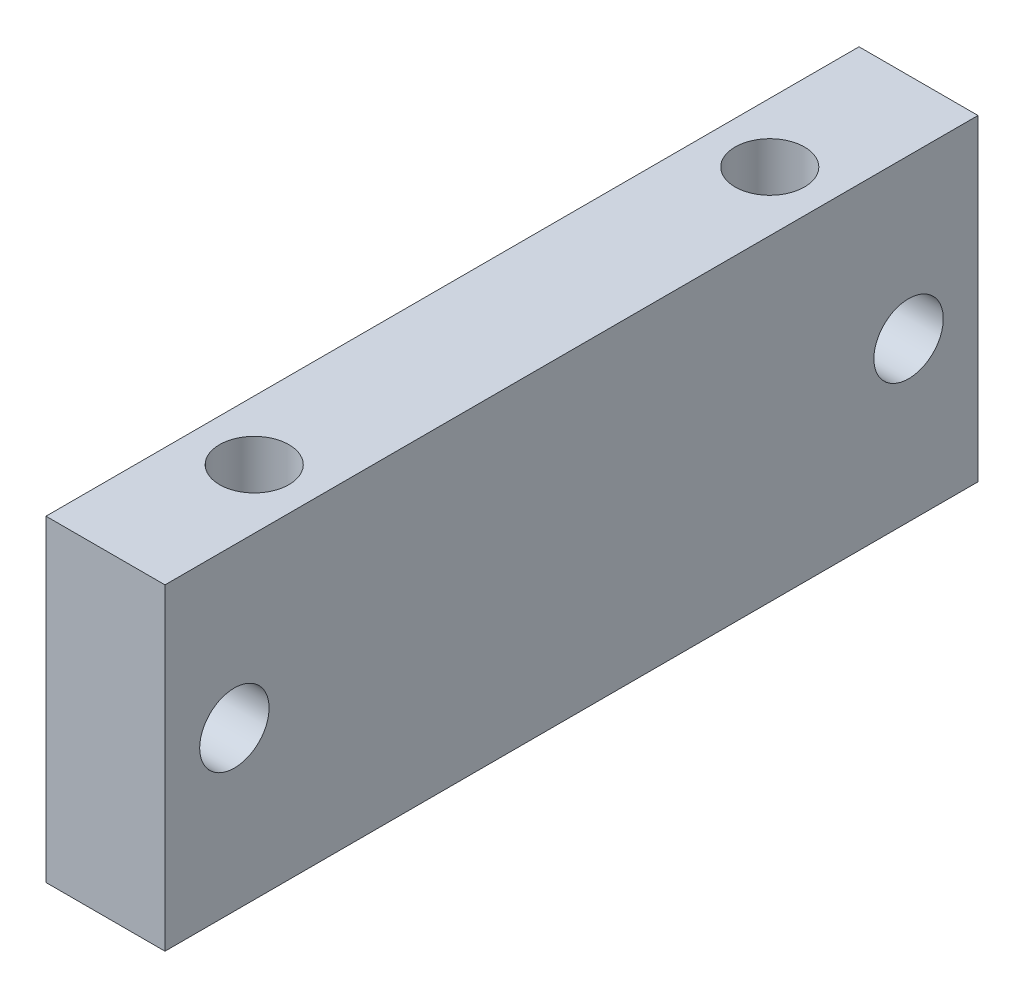
ISO-10303-21;
HEADER;
FILE_DESCRIPTION(('STEP AP214'),'2;1');
FILE_NAME('part.step','',(''),(''),'','','');
FILE_SCHEMA(('AUTOMOTIVE_DESIGN { 1 0 10303 214 1 1 1 1 }'));
ENDSEC;
DATA;
#1=APPLICATION_CONTEXT('core data for automotive mechanical design processes');
#2=APPLICATION_PROTOCOL_DEFINITION('international standard','automotive_design',2000,#1);
#3=PRODUCT_CONTEXT('',#1,'mechanical');
#4=PRODUCT('Part','Part','',(#3));
#5=PRODUCT_RELATED_PRODUCT_CATEGORY('part','',(#4));
#6=PRODUCT_DEFINITION_FORMATION('','',#4);
#7=PRODUCT_DEFINITION_CONTEXT('part definition',#1,'design');
#8=PRODUCT_DEFINITION('design','',#6,#7);
#9=PRODUCT_DEFINITION_SHAPE('','',#8);
#10=(LENGTH_UNIT() NAMED_UNIT(*) SI_UNIT(.MILLI.,.METRE.));
#11=(NAMED_UNIT(*) PLANE_ANGLE_UNIT() SI_UNIT($,.RADIAN.));
#12=(NAMED_UNIT(*) SI_UNIT($,.STERADIAN.) SOLID_ANGLE_UNIT());
#13=UNCERTAINTY_MEASURE_WITH_UNIT(LENGTH_MEASURE(1.E-05),#10,'distance_accuracy_value','');
#14=(GEOMETRIC_REPRESENTATION_CONTEXT(3) GLOBAL_UNCERTAINTY_ASSIGNED_CONTEXT((#13)) GLOBAL_UNIT_ASSIGNED_CONTEXT((#10,
#11,#12)) REPRESENTATION_CONTEXT('',''));
#15=CARTESIAN_POINT('',(0.,0.,0.));
#16=DIRECTION('',(0.,0.,1.));
#17=DIRECTION('',(1.,0.,0.));
#18=AXIS2_PLACEMENT_3D('',#15,#16,#17);
#19=CARTESIAN_POINT('',(3.,16.,20.5));
#20=DIRECTION('',(-1.,0.,0.));
#21=DIRECTION('',(0.,0.,1.));
#22=AXIS2_PLACEMENT_3D('',#19,#20,#21);
#23=PLANE('',#22);
#24=CARTESIAN_POINT('',(3.,8.,-17.));
#25=DIRECTION('',(-1.,0.,0.));
#26=DIRECTION('',(0.,0.,1.));
#27=AXIS2_PLACEMENT_3D('',#24,#25,#26);
#28=CIRCLE('',#27,1.75);
#29=CARTESIAN_POINT('',(3.,8.,-15.25));
#30=VERTEX_POINT('',#29);
#31=EDGE_CURVE('E122',#30,#30,#28,.T.);
#32=ORIENTED_EDGE('',*,*,#31,.T.);
#33=EDGE_LOOP('',(#32));
#34=FACE_BOUND('',#33,.T.);
#35=CARTESIAN_POINT('',(3.,8.,17.));
#36=DIRECTION('',(-1.,0.,0.));
#37=DIRECTION('',(0.,0.,1.));
#38=AXIS2_PLACEMENT_3D('',#35,#36,#37);
#39=CIRCLE('',#38,1.75);
#40=CARTESIAN_POINT('',(3.,8.,18.75));
#41=VERTEX_POINT('',#40);
#42=EDGE_CURVE('E130',#41,#41,#39,.T.);
#43=ORIENTED_EDGE('',*,*,#42,.T.);
#44=EDGE_LOOP('',(#43));
#45=FACE_BOUND('',#44,.T.);
#46=DIRECTION('',(0.,0.,-1.));
#47=VECTOR('',#46,1.);
#48=CARTESIAN_POINT('',(3.,0.,20.5));
#49=LINE('',#48,#47);
#50=CARTESIAN_POINT('',(3.,0.,20.5));
#51=VERTEX_POINT('',#50);
#52=CARTESIAN_POINT('',(3.,0.,-20.5));
#53=VERTEX_POINT('',#52);
#54=EDGE_CURVE('E104',#51,#53,#49,.T.);
#55=ORIENTED_EDGE('',*,*,#54,.T.);
#56=DIRECTION('',(0.,-1.,0.));
#57=VECTOR('',#56,1.);
#58=CARTESIAN_POINT('',(3.,16.,-20.5));
#59=LINE('',#58,#57);
#60=CARTESIAN_POINT('',(3.,16.,-20.5));
#61=VERTEX_POINT('',#60);
#62=EDGE_CURVE('E11',#61,#53,#59,.T.);
#63=ORIENTED_EDGE('',*,*,#62,.F.);
#64=DIRECTION('',(0.,0.,-1.));
#65=VECTOR('',#64,1.);
#66=CARTESIAN_POINT('',(3.,16.,20.5));
#67=LINE('',#66,#65);
#68=CARTESIAN_POINT('',(3.,16.,20.5));
#69=VERTEX_POINT('',#68);
#70=EDGE_CURVE('E92',#69,#61,#67,.T.);
#71=ORIENTED_EDGE('',*,*,#70,.F.);
#72=DIRECTION('',(0.,-1.,0.));
#73=VECTOR('',#72,1.);
#74=CARTESIAN_POINT('',(3.,16.,20.5));
#75=LINE('',#74,#73);
#76=EDGE_CURVE('E100',#69,#51,#75,.T.);
#77=ORIENTED_EDGE('',*,*,#76,.T.);
#78=EDGE_LOOP('',(#55,#63,#71,#77));
#79=FACE_BOUND('',#78,.T.);
#80=ADVANCED_FACE('F41',(#34,#45,#79),#23,.F.);
#81=CARTESIAN_POINT('',(-3.,16.,-20.5));
#82=DIRECTION('',(0.,0.,1.));
#83=DIRECTION('',(1.,0.,0.));
#84=AXIS2_PLACEMENT_3D('',#81,#82,#83);
#85=PLANE('',#84);
#86=DIRECTION('',(-1.,0.,0.));
#87=VECTOR('',#86,1.);
#88=CARTESIAN_POINT('',(-3.,0.,-20.5));
#89=LINE('',#88,#87);
#90=CARTESIAN_POINT('',(-3.,0.,-20.5));
#91=VERTEX_POINT('',#90);
#92=EDGE_CURVE('E96',#53,#91,#89,.T.);
#93=ORIENTED_EDGE('',*,*,#92,.T.);
#94=DIRECTION('',(0.,-1.,0.));
#95=VECTOR('',#94,1.);
#96=CARTESIAN_POINT('',(-3.,16.,-20.5));
#97=LINE('',#96,#95);
#98=CARTESIAN_POINT('',(-3.,16.,-20.5));
#99=VERTEX_POINT('',#98);
#100=EDGE_CURVE('E49',#99,#91,#97,.T.);
#101=ORIENTED_EDGE('',*,*,#100,.F.);
#102=DIRECTION('',(-1.,0.,0.));
#103=VECTOR('',#102,1.);
#104=CARTESIAN_POINT('',(-3.,16.,-20.5));
#105=LINE('',#104,#103);
#106=EDGE_CURVE('E87',#61,#99,#105,.T.);
#107=ORIENTED_EDGE('',*,*,#106,.F.);
#108=ORIENTED_EDGE('',*,*,#62,.T.);
#109=EDGE_LOOP('',(#93,#101,#107,#108));
#110=FACE_BOUND('',#109,.T.);
#111=ADVANCED_FACE('F95',(#110),#85,.F.);
#112=CARTESIAN_POINT('',(-3.,16.,20.5));
#113=DIRECTION('',(1.,0.,0.));
#114=DIRECTION('',(0.,0.,-1.));
#115=AXIS2_PLACEMENT_3D('',#112,#113,#114);
#116=PLANE('',#115);
#117=CARTESIAN_POINT('',(-3.,8.,-17.));
#118=DIRECTION('',(-1.,0.,0.));
#119=DIRECTION('',(0.,0.,1.));
#120=AXIS2_PLACEMENT_3D('',#117,#118,#119);
#121=CIRCLE('',#120,1.75);
#122=CARTESIAN_POINT('',(-3.,8.,-15.25));
#123=VERTEX_POINT('',#122);
#124=EDGE_CURVE('E136',#123,#123,#121,.T.);
#125=ORIENTED_EDGE('',*,*,#124,.F.);
#126=EDGE_LOOP('',(#125));
#127=FACE_BOUND('',#126,.T.);
#128=CARTESIAN_POINT('',(-3.,8.,17.));
#129=DIRECTION('',(-1.,0.,0.));
#130=DIRECTION('',(0.,0.,1.));
#131=AXIS2_PLACEMENT_3D('',#128,#129,#130);
#132=CIRCLE('',#131,1.75);
#133=CARTESIAN_POINT('',(-3.,8.,18.75));
#134=VERTEX_POINT('',#133);
#135=EDGE_CURVE('E133',#134,#134,#132,.T.);
#136=ORIENTED_EDGE('',*,*,#135,.F.);
#137=EDGE_LOOP('',(#136));
#138=FACE_BOUND('',#137,.T.);
#139=DIRECTION('',(0.,0.,1.));
#140=VECTOR('',#139,1.);
#141=CARTESIAN_POINT('',(-3.,0.,20.5));
#142=LINE('',#141,#140);
#143=CARTESIAN_POINT('',(-3.,0.,20.5));
#144=VERTEX_POINT('',#143);
#145=EDGE_CURVE('E74',#91,#144,#142,.T.);
#146=ORIENTED_EDGE('',*,*,#145,.T.);
#147=DIRECTION('',(0.,-1.,0.));
#148=VECTOR('',#147,1.);
#149=CARTESIAN_POINT('',(-3.,16.,20.5));
#150=LINE('',#149,#148);
#151=CARTESIAN_POINT('',(-3.,16.,20.5));
#152=VERTEX_POINT('',#151);
#153=EDGE_CURVE('E97',#152,#144,#150,.T.);
#154=ORIENTED_EDGE('',*,*,#153,.F.);
#155=DIRECTION('',(0.,0.,1.));
#156=VECTOR('',#155,1.);
#157=CARTESIAN_POINT('',(-3.,16.,20.5));
#158=LINE('',#157,#156);
#159=EDGE_CURVE('E90',#99,#152,#158,.T.);
#160=ORIENTED_EDGE('',*,*,#159,.F.);
#161=ORIENTED_EDGE('',*,*,#100,.T.);
#162=EDGE_LOOP('',(#146,#154,#160,#161));
#163=FACE_BOUND('',#162,.T.);
#164=ADVANCED_FACE('F98',(#127,#138,#163),#116,.F.);
#165=CARTESIAN_POINT('',(-3.,16.,20.5));
#166=DIRECTION('',(0.,0.,-1.));
#167=DIRECTION('',(-1.,0.,0.));
#168=AXIS2_PLACEMENT_3D('',#165,#166,#167);
#169=PLANE('',#168);
#170=DIRECTION('',(1.,0.,0.));
#171=VECTOR('',#170,1.);
#172=CARTESIAN_POINT('',(-3.,0.,20.5));
#173=LINE('',#172,#171);
#174=EDGE_CURVE('E80',#144,#51,#173,.T.);
#175=ORIENTED_EDGE('',*,*,#174,.T.);
#176=ORIENTED_EDGE('',*,*,#76,.F.);
#177=DIRECTION('',(1.,0.,0.));
#178=VECTOR('',#177,1.);
#179=CARTESIAN_POINT('',(-3.,16.,20.5));
#180=LINE('',#179,#178);
#181=EDGE_CURVE('E57',#152,#69,#180,.T.);
#182=ORIENTED_EDGE('',*,*,#181,.F.);
#183=ORIENTED_EDGE('',*,*,#153,.T.);
#184=EDGE_LOOP('',(#175,#176,#182,#183));
#185=FACE_BOUND('',#184,.T.);
#186=ADVANCED_FACE('F112',(#185),#169,.F.);
#187=CARTESIAN_POINT('',(0.,16.,0.));
#188=DIRECTION('',(0.,-1.,0.));
#189=DIRECTION('',(0.,0.,-1.));
#190=AXIS2_PLACEMENT_3D('',#187,#188,#189);
#191=PLANE('',#190);
#192=CARTESIAN_POINT('',(0.,16.,-13.));
#193=DIRECTION('',(0.,1.,0.));
#194=DIRECTION('',(0.,0.,1.));
#195=AXIS2_PLACEMENT_3D('',#192,#193,#194);
#196=CIRCLE('',#195,1.75);
#197=CARTESIAN_POINT('',(0.,16.,-11.25));
#198=VERTEX_POINT('',#197);
#199=EDGE_CURVE('E125',#198,#198,#196,.T.);
#200=ORIENTED_EDGE('',*,*,#199,.F.);
#201=EDGE_LOOP('',(#200));
#202=FACE_BOUND('',#201,.T.);
#203=CARTESIAN_POINT('',(0.,16.,13.));
#204=DIRECTION('',(0.,1.,0.));
#205=DIRECTION('',(0.,0.,1.));
#206=AXIS2_PLACEMENT_3D('',#203,#204,#205);
#207=CIRCLE('',#206,1.75);
#208=CARTESIAN_POINT('',(0.,16.,14.75));
#209=VERTEX_POINT('',#208);
#210=EDGE_CURVE('E121',#209,#209,#207,.T.);
#211=ORIENTED_EDGE('',*,*,#210,.F.);
#212=EDGE_LOOP('',(#211));
#213=FACE_BOUND('',#212,.T.);
#214=ORIENTED_EDGE('',*,*,#70,.T.);
#215=ORIENTED_EDGE('',*,*,#106,.T.);
#216=ORIENTED_EDGE('',*,*,#159,.T.);
#217=ORIENTED_EDGE('',*,*,#181,.T.);
#218=EDGE_LOOP('',(#214,#215,#216,#217));
#219=FACE_BOUND('',#218,.T.);
#220=ADVANCED_FACE('F88',(#202,#213,#219),#191,.F.);
#221=CARTESIAN_POINT('',(0.,0.,0.));
#222=DIRECTION('',(0.,-1.,0.));
#223=DIRECTION('',(0.,0.,-1.));
#224=AXIS2_PLACEMENT_3D('',#221,#222,#223);
#225=PLANE('',#224);
#226=CARTESIAN_POINT('',(0.,0.,-13.));
#227=DIRECTION('',(0.,1.,0.));
#228=DIRECTION('',(0.,0.,1.));
#229=AXIS2_PLACEMENT_3D('',#226,#227,#228);
#230=CIRCLE('',#229,1.75);
#231=CARTESIAN_POINT('',(0.,0.,-11.25));
#232=VERTEX_POINT('',#231);
#233=EDGE_CURVE('E107',#232,#232,#230,.T.);
#234=ORIENTED_EDGE('',*,*,#233,.T.);
#235=EDGE_LOOP('',(#234));
#236=FACE_BOUND('',#235,.T.);
#237=CARTESIAN_POINT('',(0.,0.,13.));
#238=DIRECTION('',(0.,1.,0.));
#239=DIRECTION('',(0.,0.,1.));
#240=AXIS2_PLACEMENT_3D('',#237,#238,#239);
#241=CIRCLE('',#240,1.75);
#242=CARTESIAN_POINT('',(0.,0.,14.75));
#243=VERTEX_POINT('',#242);
#244=EDGE_CURVE('E118',#243,#243,#241,.T.);
#245=ORIENTED_EDGE('',*,*,#244,.T.);
#246=EDGE_LOOP('',(#245));
#247=FACE_BOUND('',#246,.T.);
#248=ORIENTED_EDGE('',*,*,#54,.F.);
#249=ORIENTED_EDGE('',*,*,#174,.F.);
#250=ORIENTED_EDGE('',*,*,#145,.F.);
#251=ORIENTED_EDGE('',*,*,#92,.F.);
#252=EDGE_LOOP('',(#248,#249,#250,#251));
#253=FACE_BOUND('',#252,.T.);
#254=ADVANCED_FACE('F115',(#236,#247,#253),#225,.T.);
#255=CARTESIAN_POINT('',(0.,0.,13.));
#256=DIRECTION('',(0.,1.,0.));
#257=DIRECTION('',(0.,0.,1.));
#258=AXIS2_PLACEMENT_3D('',#255,#256,#257);
#259=CYLINDRICAL_SURFACE('',#258,1.75);
#260=ORIENTED_EDGE('',*,*,#244,.F.);
#261=EDGE_LOOP('',(#260));
#262=FACE_BOUND('',#261,.T.);
#263=ORIENTED_EDGE('',*,*,#210,.T.);
#264=EDGE_LOOP('',(#263));
#265=FACE_BOUND('',#264,.T.);
#266=ADVANCED_FACE('F163',(#262,#265),#259,.F.);
#267=CARTESIAN_POINT('',(0.,0.,-13.));
#268=DIRECTION('',(0.,1.,0.));
#269=DIRECTION('',(0.,0.,1.));
#270=AXIS2_PLACEMENT_3D('',#267,#268,#269);
#271=CYLINDRICAL_SURFACE('',#270,1.75);
#272=ORIENTED_EDGE('',*,*,#233,.F.);
#273=EDGE_LOOP('',(#272));
#274=FACE_BOUND('',#273,.T.);
#275=ORIENTED_EDGE('',*,*,#199,.T.);
#276=EDGE_LOOP('',(#275));
#277=FACE_BOUND('',#276,.T.);
#278=ADVANCED_FACE('F157',(#274,#277),#271,.F.);
#279=CARTESIAN_POINT('',(3.,8.,17.));
#280=DIRECTION('',(-1.,0.,0.));
#281=DIRECTION('',(0.,0.,1.));
#282=AXIS2_PLACEMENT_3D('',#279,#280,#281);
#283=CYLINDRICAL_SURFACE('',#282,1.75);
#284=ORIENTED_EDGE('',*,*,#42,.F.);
#285=EDGE_LOOP('',(#284));
#286=FACE_BOUND('',#285,.T.);
#287=ORIENTED_EDGE('',*,*,#135,.T.);
#288=EDGE_LOOP('',(#287));
#289=FACE_BOUND('',#288,.T.);
#290=ADVANCED_FACE('F147',(#286,#289),#283,.F.);
#291=CARTESIAN_POINT('',(3.,8.,-17.));
#292=DIRECTION('',(-1.,0.,0.));
#293=DIRECTION('',(0.,0.,1.));
#294=AXIS2_PLACEMENT_3D('',#291,#292,#293);
#295=CYLINDRICAL_SURFACE('',#294,1.75);
#296=ORIENTED_EDGE('',*,*,#31,.F.);
#297=EDGE_LOOP('',(#296));
#298=FACE_BOUND('',#297,.T.);
#299=ORIENTED_EDGE('',*,*,#124,.T.);
#300=EDGE_LOOP('',(#299));
#301=FACE_BOUND('',#300,.T.);
#302=ADVANCED_FACE('F144',(#298,#301),#295,.F.);
#303=CLOSED_SHELL('',(#80,#111,#164,#186,#220,#254,#266,#278,#290,#302));
#304=MANIFOLD_SOLID_BREP('B2',#303);
#305=ADVANCED_BREP_SHAPE_REPRESENTATION('',(#18,#304),#14);
#306=SHAPE_DEFINITION_REPRESENTATION(#9,#305);
ENDSEC;
END-ISO-10303-21;
